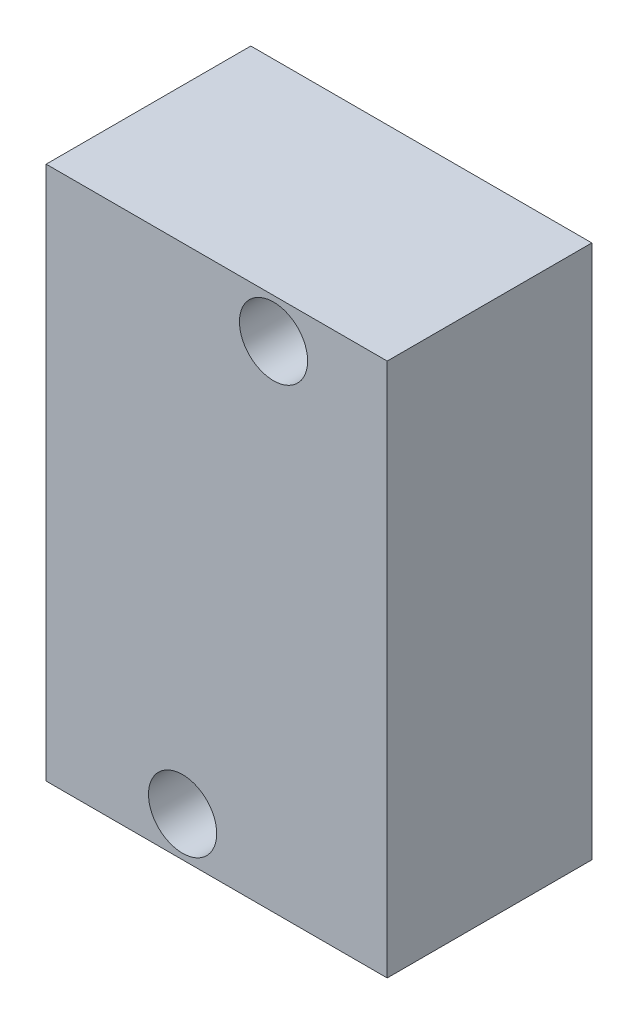
ISO-10303-21;
HEADER;
FILE_DESCRIPTION(('STEP AP214'),'2;1');
FILE_NAME('part.step','',(''),(''),'','','');
FILE_SCHEMA(('AUTOMOTIVE_DESIGN { 1 0 10303 214 1 1 1 1 }'));
ENDSEC;
DATA;
#1=APPLICATION_CONTEXT('core data for automotive mechanical design processes');
#2=APPLICATION_PROTOCOL_DEFINITION('international standard','automotive_design',2000,#1);
#3=PRODUCT_CONTEXT('',#1,'mechanical');
#4=PRODUCT('Part','Part','',(#3));
#5=PRODUCT_RELATED_PRODUCT_CATEGORY('part','',(#4));
#6=PRODUCT_DEFINITION_FORMATION('','',#4);
#7=PRODUCT_DEFINITION_CONTEXT('part definition',#1,'design');
#8=PRODUCT_DEFINITION('design','',#6,#7);
#9=PRODUCT_DEFINITION_SHAPE('','',#8);
#10=(LENGTH_UNIT() NAMED_UNIT(*) SI_UNIT(.MILLI.,.METRE.));
#11=(NAMED_UNIT(*) PLANE_ANGLE_UNIT() SI_UNIT($,.RADIAN.));
#12=(NAMED_UNIT(*) SI_UNIT($,.STERADIAN.) SOLID_ANGLE_UNIT());
#13=UNCERTAINTY_MEASURE_WITH_UNIT(LENGTH_MEASURE(1.E-05),#10,'distance_accuracy_value','');
#14=(GEOMETRIC_REPRESENTATION_CONTEXT(3) GLOBAL_UNCERTAINTY_ASSIGNED_CONTEXT((#13)) GLOBAL_UNIT_ASSIGNED_CONTEXT((#10,
#11,#12)) REPRESENTATION_CONTEXT('',''));
#15=CARTESIAN_POINT('',(0.,0.,0.));
#16=DIRECTION('',(0.,0.,1.));
#17=DIRECTION('',(1.,0.,0.));
#18=AXIS2_PLACEMENT_3D('',#15,#16,#17);
#19=CARTESIAN_POINT('',(-6.20966850828729,5.73604972375691,11.43));
#20=DIRECTION('',(1.,0.,0.));
#21=DIRECTION('',(0.,1.,0.));
#22=AXIS2_PLACEMENT_3D('',#19,#20,#21);
#23=PLANE('',#22);
#24=DIRECTION('',(0.,-1.,0.));
#25=VECTOR('',#24,1.);
#26=CARTESIAN_POINT('',(-6.20966850828729,5.73604972375691,0.));
#27=LINE('',#26,#25);
#28=CARTESIAN_POINT('',(-6.20966850828729,5.73604972375691,0.));
#29=VERTEX_POINT('',#28);
#30=CARTESIAN_POINT('',(-6.20966850828728,-24.1089502762431,0.));
#31=VERTEX_POINT('',#30);
#32=EDGE_CURVE('E107',#29,#31,#27,.T.);
#33=ORIENTED_EDGE('',*,*,#32,.T.);
#34=DIRECTION('',(0.,0.,-1.));
#35=VECTOR('',#34,1.);
#36=CARTESIAN_POINT('',(-6.20966850828728,-24.1089502762431,11.43));
#37=LINE('',#36,#35);
#38=CARTESIAN_POINT('',(-6.20966850828728,-24.1089502762431,11.43));
#39=VERTEX_POINT('',#38);
#40=EDGE_CURVE('E11',#39,#31,#37,.T.);
#41=ORIENTED_EDGE('',*,*,#40,.F.);
#42=DIRECTION('',(0.,-1.,0.));
#43=VECTOR('',#42,1.);
#44=CARTESIAN_POINT('',(-6.20966850828729,5.73604972375691,11.43));
#45=LINE('',#44,#43);
#46=CARTESIAN_POINT('',(-6.20966850828729,5.73604972375691,11.43));
#47=VERTEX_POINT('',#46);
#48=EDGE_CURVE('E91',#47,#39,#45,.T.);
#49=ORIENTED_EDGE('',*,*,#48,.F.);
#50=DIRECTION('',(0.,0.,-1.));
#51=VECTOR('',#50,1.);
#52=CARTESIAN_POINT('',(-6.20966850828729,5.73604972375691,11.43));
#53=LINE('',#52,#51);
#54=EDGE_CURVE('E103',#47,#29,#53,.T.);
#55=ORIENTED_EDGE('',*,*,#54,.T.);
#56=EDGE_LOOP('',(#33,#41,#49,#55));
#57=FACE_BOUND('',#56,.T.);
#58=ADVANCED_FACE('F39',(#57),#23,.F.);
#59=CARTESIAN_POINT('',(-6.20966850828728,-24.1089502762431,11.43));
#60=DIRECTION('',(0.,1.,0.));
#61=DIRECTION('',(0.,0.,1.));
#62=AXIS2_PLACEMENT_3D('',#59,#60,#61);
#63=PLANE('',#62);
#64=DIRECTION('',(1.,0.,0.));
#65=VECTOR('',#64,1.);
#66=CARTESIAN_POINT('',(-6.20966850828728,-24.1089502762431,0.));
#67=LINE('',#66,#65);
#68=CARTESIAN_POINT('',(12.8403314917127,-24.1089502762431,0.));
#69=VERTEX_POINT('',#68);
#70=EDGE_CURVE('E96',#31,#69,#67,.T.);
#71=ORIENTED_EDGE('',*,*,#70,.T.);
#72=DIRECTION('',(0.,0.,-1.));
#73=VECTOR('',#72,1.);
#74=CARTESIAN_POINT('',(12.8403314917127,-24.1089502762431,11.43));
#75=LINE('',#74,#73);
#76=CARTESIAN_POINT('',(12.8403314917127,-24.1089502762431,11.43));
#77=VERTEX_POINT('',#76);
#78=EDGE_CURVE('E48',#77,#69,#75,.T.);
#79=ORIENTED_EDGE('',*,*,#78,.F.);
#80=DIRECTION('',(1.,0.,0.));
#81=VECTOR('',#80,1.);
#82=CARTESIAN_POINT('',(-6.20966850828728,-24.1089502762431,11.43));
#83=LINE('',#82,#81);
#84=EDGE_CURVE('E86',#39,#77,#83,.T.);
#85=ORIENTED_EDGE('',*,*,#84,.F.);
#86=ORIENTED_EDGE('',*,*,#40,.T.);
#87=EDGE_LOOP('',(#71,#79,#85,#86));
#88=FACE_BOUND('',#87,.T.);
#89=ADVANCED_FACE('F95',(#88),#63,.F.);
#90=CARTESIAN_POINT('',(12.8403314917127,5.73604972375691,11.43));
#91=DIRECTION('',(-1.,0.,0.));
#92=DIRECTION('',(0.,-1.,0.));
#93=AXIS2_PLACEMENT_3D('',#90,#91,#92);
#94=PLANE('',#93);
#95=DIRECTION('',(0.,1.,0.));
#96=VECTOR('',#95,1.);
#97=CARTESIAN_POINT('',(12.8403314917127,5.73604972375691,0.));
#98=LINE('',#97,#96);
#99=CARTESIAN_POINT('',(12.8403314917127,5.73604972375691,0.));
#100=VERTEX_POINT('',#99);
#101=EDGE_CURVE('E73',#69,#100,#98,.T.);
#102=ORIENTED_EDGE('',*,*,#101,.T.);
#103=DIRECTION('',(0.,0.,-1.));
#104=VECTOR('',#103,1.);
#105=CARTESIAN_POINT('',(12.8403314917127,5.73604972375691,11.43));
#106=LINE('',#105,#104);
#107=CARTESIAN_POINT('',(12.8403314917127,5.73604972375691,11.43));
#108=VERTEX_POINT('',#107);
#109=EDGE_CURVE('E98',#108,#100,#106,.T.);
#110=ORIENTED_EDGE('',*,*,#109,.F.);
#111=DIRECTION('',(0.,1.,0.));
#112=VECTOR('',#111,1.);
#113=CARTESIAN_POINT('',(12.8403314917127,5.73604972375691,11.43));
#114=LINE('',#113,#112);
#115=EDGE_CURVE('E89',#77,#108,#114,.T.);
#116=ORIENTED_EDGE('',*,*,#115,.F.);
#117=ORIENTED_EDGE('',*,*,#78,.T.);
#118=EDGE_LOOP('',(#102,#110,#116,#117));
#119=FACE_BOUND('',#118,.T.);
#120=ADVANCED_FACE('F99',(#119),#94,.F.);
#121=CARTESIAN_POINT('',(-6.20966850828729,5.73604972375691,11.43));
#122=DIRECTION('',(0.,-1.,0.));
#123=DIRECTION('',(0.,0.,-1.));
#124=AXIS2_PLACEMENT_3D('',#121,#122,#123);
#125=PLANE('',#124);
#126=DIRECTION('',(-1.,0.,0.));
#127=VECTOR('',#126,1.);
#128=CARTESIAN_POINT('',(-6.20966850828729,5.73604972375691,0.));
#129=LINE('',#128,#127);
#130=EDGE_CURVE('E79',#100,#29,#129,.T.);
#131=ORIENTED_EDGE('',*,*,#130,.T.);
#132=ORIENTED_EDGE('',*,*,#54,.F.);
#133=DIRECTION('',(-1.,0.,0.));
#134=VECTOR('',#133,1.);
#135=CARTESIAN_POINT('',(-6.20966850828729,5.73604972375691,11.43));
#136=LINE('',#135,#134);
#137=EDGE_CURVE('E56',#108,#47,#136,.T.);
#138=ORIENTED_EDGE('',*,*,#137,.F.);
#139=ORIENTED_EDGE('',*,*,#109,.T.);
#140=EDGE_LOOP('',(#131,#132,#138,#139));
#141=FACE_BOUND('',#140,.T.);
#142=ADVANCED_FACE('F121',(#141),#125,.F.);
#143=CARTESIAN_POINT('',(0.,0.,11.43));
#144=DIRECTION('',(0.,0.,1.));
#145=DIRECTION('',(1.,0.,0.));
#146=AXIS2_PLACEMENT_3D('',#143,#144,#145);
#147=PLANE('',#146);
#148=CARTESIAN_POINT('',(6.49033149171271,3.5135497237569,11.43));
#149=DIRECTION('',(0.,0.,1.));
#150=DIRECTION('',(1.,0.,0.));
#151=AXIS2_PLACEMENT_3D('',#148,#149,#150);
#152=CIRCLE('',#151,1.905);
#153=CARTESIAN_POINT('',(8.39533149171271,3.5135497237569,11.43));
#154=VERTEX_POINT('',#153);
#155=EDGE_CURVE('E136',#154,#154,#152,.T.);
#156=ORIENTED_EDGE('',*,*,#155,.F.);
#157=EDGE_LOOP('',(#156));
#158=FACE_BOUND('',#157,.T.);
#159=CARTESIAN_POINT('',(1.41033149171271,-21.8864502762431,11.43));
#160=DIRECTION('',(0.,0.,1.));
#161=DIRECTION('',(1.,0.,0.));
#162=AXIS2_PLACEMENT_3D('',#159,#160,#161);
#163=CIRCLE('',#162,1.905);
#164=CARTESIAN_POINT('',(3.31533149171271,-21.8864502762431,11.43));
#165=VERTEX_POINT('',#164);
#166=EDGE_CURVE('E128',#165,#165,#163,.T.);
#167=ORIENTED_EDGE('',*,*,#166,.F.);
#168=EDGE_LOOP('',(#167));
#169=FACE_BOUND('',#168,.T.);
#170=ORIENTED_EDGE('',*,*,#48,.T.);
#171=ORIENTED_EDGE('',*,*,#84,.T.);
#172=ORIENTED_EDGE('',*,*,#115,.T.);
#173=ORIENTED_EDGE('',*,*,#137,.T.);
#174=EDGE_LOOP('',(#170,#171,#172,#173));
#175=FACE_BOUND('',#174,.T.);
#176=ADVANCED_FACE('F87',(#158,#169,#175),#147,.T.);
#177=CARTESIAN_POINT('',(0.,0.,0.));
#178=DIRECTION('',(0.,0.,1.));
#179=DIRECTION('',(1.,0.,0.));
#180=AXIS2_PLACEMENT_3D('',#177,#178,#179);
#181=PLANE('',#180);
#182=CARTESIAN_POINT('',(6.49033149171271,3.5135497237569,0.));
#183=DIRECTION('',(0.,0.,1.));
#184=DIRECTION('',(1.,0.,0.));
#185=AXIS2_PLACEMENT_3D('',#182,#183,#184);
#186=CIRCLE('',#185,1.905);
#187=CARTESIAN_POINT('',(8.39533149171271,3.5135497237569,0.));
#188=VERTEX_POINT('',#187);
#189=EDGE_CURVE('E111',#188,#188,#186,.T.);
#190=ORIENTED_EDGE('',*,*,#189,.T.);
#191=EDGE_LOOP('',(#190));
#192=FACE_BOUND('',#191,.T.);
#193=CARTESIAN_POINT('',(1.41033149171271,-21.8864502762431,0.));
#194=DIRECTION('',(0.,0.,1.));
#195=DIRECTION('',(1.,0.,0.));
#196=AXIS2_PLACEMENT_3D('',#193,#194,#195);
#197=CIRCLE('',#196,1.905);
#198=CARTESIAN_POINT('',(3.31533149171271,-21.8864502762431,0.));
#199=VERTEX_POINT('',#198);
#200=EDGE_CURVE('E132',#199,#199,#197,.T.);
#201=ORIENTED_EDGE('',*,*,#200,.T.);
#202=EDGE_LOOP('',(#201));
#203=FACE_BOUND('',#202,.T.);
#204=ORIENTED_EDGE('',*,*,#32,.F.);
#205=ORIENTED_EDGE('',*,*,#130,.F.);
#206=ORIENTED_EDGE('',*,*,#101,.F.);
#207=ORIENTED_EDGE('',*,*,#70,.F.);
#208=EDGE_LOOP('',(#204,#205,#206,#207));
#209=FACE_BOUND('',#208,.T.);
#210=ADVANCED_FACE('F124',(#192,#203,#209),#181,.F.);
#211=CARTESIAN_POINT('',(1.41033149171271,-21.8864502762431,0.));
#212=DIRECTION('',(0.,0.,1.));
#213=DIRECTION('',(1.,0.,0.));
#214=AXIS2_PLACEMENT_3D('',#211,#212,#213);
#215=CYLINDRICAL_SURFACE('',#214,1.905);
#216=ORIENTED_EDGE('',*,*,#200,.F.);
#217=EDGE_LOOP('',(#216));
#218=FACE_BOUND('',#217,.T.);
#219=ORIENTED_EDGE('',*,*,#166,.T.);
#220=EDGE_LOOP('',(#219));
#221=FACE_BOUND('',#220,.T.);
#222=ADVANCED_FACE('F149',(#218,#221),#215,.F.);
#223=CARTESIAN_POINT('',(6.49033149171271,3.5135497237569,0.));
#224=DIRECTION('',(0.,0.,1.));
#225=DIRECTION('',(1.,0.,0.));
#226=AXIS2_PLACEMENT_3D('',#223,#224,#225);
#227=CYLINDRICAL_SURFACE('',#226,1.905);
#228=ORIENTED_EDGE('',*,*,#189,.F.);
#229=EDGE_LOOP('',(#228));
#230=FACE_BOUND('',#229,.T.);
#231=ORIENTED_EDGE('',*,*,#155,.T.);
#232=EDGE_LOOP('',(#231));
#233=FACE_BOUND('',#232,.T.);
#234=ADVANCED_FACE('F146',(#230,#233),#227,.F.);
#235=CLOSED_SHELL('',(#58,#89,#120,#142,#176,#210,#222,#234));
#236=MANIFOLD_SOLID_BREP('B2',#235);
#237=ADVANCED_BREP_SHAPE_REPRESENTATION('',(#18,#236),#14);
#238=SHAPE_DEFINITION_REPRESENTATION(#9,#237);
ENDSEC;
END-ISO-10303-21;
